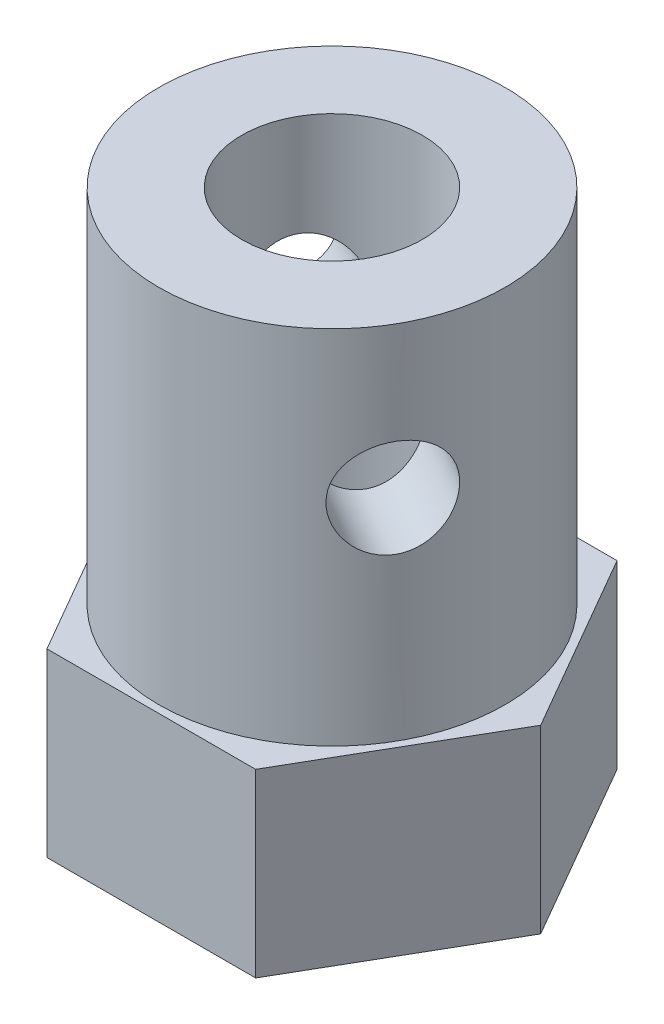
ISO-10303-21;
HEADER;
FILE_DESCRIPTION(('STEP AP214'),'2;1');
FILE_NAME('part.step','',(''),(''),'','','');
FILE_SCHEMA(('AUTOMOTIVE_DESIGN { 1 0 10303 214 1 1 1 1 }'));
ENDSEC;
DATA;
#1=APPLICATION_CONTEXT('core data for automotive mechanical design processes');
#2=APPLICATION_PROTOCOL_DEFINITION('international standard','automotive_design',2000,#1);
#3=PRODUCT_CONTEXT('',#1,'mechanical');
#4=PRODUCT('Part','Part','',(#3));
#5=PRODUCT_RELATED_PRODUCT_CATEGORY('part','',(#4));
#6=PRODUCT_DEFINITION_FORMATION('','',#4);
#7=PRODUCT_DEFINITION_CONTEXT('part definition',#1,'design');
#8=PRODUCT_DEFINITION('design','',#6,#7);
#9=PRODUCT_DEFINITION_SHAPE('','',#8);
#10=(LENGTH_UNIT() NAMED_UNIT(*) SI_UNIT(.MILLI.,.METRE.));
#11=(NAMED_UNIT(*) PLANE_ANGLE_UNIT() SI_UNIT($,.RADIAN.));
#12=(NAMED_UNIT(*) SI_UNIT($,.STERADIAN.) SOLID_ANGLE_UNIT());
#13=UNCERTAINTY_MEASURE_WITH_UNIT(LENGTH_MEASURE(1.E-05),#10,'distance_accuracy_value','');
#14=(GEOMETRIC_REPRESENTATION_CONTEXT(3) GLOBAL_UNCERTAINTY_ASSIGNED_CONTEXT((#13)) GLOBAL_UNIT_ASSIGNED_CONTEXT((#10,
#11,#12)) REPRESENTATION_CONTEXT('',''));
#15=CARTESIAN_POINT('',(0.,0.,0.));
#16=DIRECTION('',(0.,0.,1.));
#17=DIRECTION('',(1.,0.,0.));
#18=AXIS2_PLACEMENT_3D('',#15,#16,#17);
#19=CARTESIAN_POINT('',(0.,300.,0.));
#20=DIRECTION('',(0.,-1.,0.));
#21=DIRECTION('',(0.,0.,-1.));
#22=AXIS2_PLACEMENT_3D('',#19,#20,#21);
#23=CYLINDRICAL_SURFACE('',#22,1.625);
#24=CARTESIAN_POINT('',(0.,0.,0.));
#25=DIRECTION('',(0.,-1.,0.));
#26=DIRECTION('',(0.,0.,-1.));
#27=AXIS2_PLACEMENT_3D('',#24,#25,#26);
#28=CIRCLE('',#27,1.625);
#29=CARTESIAN_POINT('',(0.,0.,-1.625));
#30=VERTEX_POINT('',#29);
#31=EDGE_CURVE('E154',#30,#30,#28,.T.);
#32=ORIENTED_EDGE('',*,*,#31,.T.);
#33=EDGE_LOOP('',(#32));
#34=FACE_BOUND('',#33,.T.);
#35=CARTESIAN_POINT('',(0.,6.00000000000001,0.));
#36=DIRECTION('',(0.,1.,0.));
#37=DIRECTION('',(0.,0.,1.));
#38=AXIS2_PLACEMENT_3D('',#35,#36,#37);
#39=CIRCLE('',#38,1.625);
#40=CARTESIAN_POINT('',(0.,6.00000000000001,1.625));
#41=VERTEX_POINT('',#40);
#42=EDGE_CURVE('E152',#41,#41,#39,.F.);
#43=ORIENTED_EDGE('',*,*,#42,.F.);
#44=EDGE_LOOP('',(#43));
#45=FACE_BOUND('',#44,.T.);
#46=ADVANCED_FACE('F40',(#34,#45),#23,.F.);
#47=CARTESIAN_POINT('',(3.46410161513775,6.,6.00000000000003));
#48=DIRECTION('',(-0.866025403784439,0.,-0.499999999999999));
#49=DIRECTION('',(-0.499999999999999,0.,0.866025403784439));
#50=AXIS2_PLACEMENT_3D('',#47,#48,#49);
#51=PLANE('',#50);
#52=DIRECTION('',(0.499999999999999,0.,-0.866025403784439));
#53=VECTOR('',#52,1.);
#54=CARTESIAN_POINT('',(3.46410161513775,0.,6.00000000000003));
#55=LINE('',#54,#53);
#56=CARTESIAN_POINT('',(3.46410161513775,0.,6.00000000000003));
#57=VERTEX_POINT('',#56);
#58=CARTESIAN_POINT('',(6.92820323027551,0.,0.));
#59=VERTEX_POINT('',#58);
#60=EDGE_CURVE('E133',#57,#59,#55,.T.);
#61=ORIENTED_EDGE('',*,*,#60,.T.);
#62=DIRECTION('',(0.,-1.,0.));
#63=VECTOR('',#62,1.);
#64=CARTESIAN_POINT('',(6.92820323027551,6.,0.));
#65=LINE('',#64,#63);
#66=CARTESIAN_POINT('',(6.92820323027551,6.,0.));
#67=VERTEX_POINT('',#66);
#68=EDGE_CURVE('E55',#67,#59,#65,.T.);
#69=ORIENTED_EDGE('',*,*,#68,.F.);
#70=DIRECTION('',(0.499999999999999,0.,-0.866025403784439));
#71=VECTOR('',#70,1.);
#72=CARTESIAN_POINT('',(3.46410161513775,6.,6.00000000000003));
#73=LINE('',#72,#71);
#74=CARTESIAN_POINT('',(3.46410161513775,6.,6.00000000000003));
#75=VERTEX_POINT('',#74);
#76=EDGE_CURVE('E144',#75,#67,#73,.T.);
#77=ORIENTED_EDGE('',*,*,#76,.F.);
#78=DIRECTION('',(0.,-1.,0.));
#79=VECTOR('',#78,1.);
#80=CARTESIAN_POINT('',(3.46410161513775,6.,6.00000000000003));
#81=LINE('',#80,#79);
#82=EDGE_CURVE('E129',#75,#57,#81,.T.);
#83=ORIENTED_EDGE('',*,*,#82,.T.);
#84=EDGE_LOOP('',(#61,#69,#77,#83));
#85=FACE_BOUND('',#84,.T.);
#86=ADVANCED_FACE('F42',(#85),#51,.F.);
#87=CARTESIAN_POINT('',(6.92820323027551,6.,0.));
#88=DIRECTION('',(-0.866025403784438,0.,0.5));
#89=DIRECTION('',(0.5,0.,0.866025403784439));
#90=AXIS2_PLACEMENT_3D('',#87,#88,#89);
#91=PLANE('',#90);
#92=DIRECTION('',(-0.5,0.,-0.866025403784439));
#93=VECTOR('',#92,1.);
#94=CARTESIAN_POINT('',(6.92820323027551,0.,0.));
#95=LINE('',#94,#93);
#96=CARTESIAN_POINT('',(3.46410161513772,0.,-6.00000000000004));
#97=VERTEX_POINT('',#96);
#98=EDGE_CURVE('E136',#59,#97,#95,.T.);
#99=ORIENTED_EDGE('',*,*,#98,.T.);
#100=DIRECTION('',(0.,-1.,0.));
#101=VECTOR('',#100,1.);
#102=CARTESIAN_POINT('',(3.46410161513772,6.,-6.00000000000004));
#103=LINE('',#102,#101);
#104=CARTESIAN_POINT('',(3.46410161513772,6.,-6.00000000000004));
#105=VERTEX_POINT('',#104);
#106=EDGE_CURVE('E148',#105,#97,#103,.T.);
#107=ORIENTED_EDGE('',*,*,#106,.F.);
#108=DIRECTION('',(-0.5,0.,-0.866025403784439));
#109=VECTOR('',#108,1.);
#110=CARTESIAN_POINT('',(6.92820323027551,6.,0.));
#111=LINE('',#110,#109);
#112=EDGE_CURVE('E102',#67,#105,#111,.T.);
#113=ORIENTED_EDGE('',*,*,#112,.F.);
#114=ORIENTED_EDGE('',*,*,#68,.T.);
#115=EDGE_LOOP('',(#99,#107,#113,#114));
#116=FACE_BOUND('',#115,.T.);
#117=ADVANCED_FACE('F211',(#116),#91,.F.);
#118=CARTESIAN_POINT('',(3.46410161513772,6.,-6.00000000000004));
#119=DIRECTION('',(0.,0.,1.));
#120=DIRECTION('',(1.,0.,0.));
#121=AXIS2_PLACEMENT_3D('',#118,#119,#120);
#122=PLANE('',#121);
#123=DIRECTION('',(-1.,0.,0.));
#124=VECTOR('',#123,1.);
#125=CARTESIAN_POINT('',(3.46410161513772,0.,-6.00000000000004));
#126=LINE('',#125,#124);
#127=CARTESIAN_POINT('',(-3.46410161513776,0.,-6.00000000000004));
#128=VERTEX_POINT('',#127);
#129=EDGE_CURVE('E139',#97,#128,#126,.T.);
#130=ORIENTED_EDGE('',*,*,#129,.T.);
#131=DIRECTION('',(0.,-1.,0.));
#132=VECTOR('',#131,1.);
#133=CARTESIAN_POINT('',(-3.46410161513776,6.,-6.00000000000004));
#134=LINE('',#133,#132);
#135=CARTESIAN_POINT('',(-3.46410161513776,6.,-6.00000000000004));
#136=VERTEX_POINT('',#135);
#137=EDGE_CURVE('E124',#136,#128,#134,.T.);
#138=ORIENTED_EDGE('',*,*,#137,.F.);
#139=DIRECTION('',(-1.,0.,0.));
#140=VECTOR('',#139,1.);
#141=CARTESIAN_POINT('',(3.46410161513772,6.,-6.00000000000004));
#142=LINE('',#141,#140);
#143=EDGE_CURVE('E115',#105,#136,#142,.T.);
#144=ORIENTED_EDGE('',*,*,#143,.F.);
#145=ORIENTED_EDGE('',*,*,#106,.T.);
#146=EDGE_LOOP('',(#130,#138,#144,#145));
#147=FACE_BOUND('',#146,.T.);
#148=ADVANCED_FACE('F209',(#147),#122,.F.);
#149=CARTESIAN_POINT('',(-3.46410161513776,6.,-6.00000000000004));
#150=DIRECTION('',(0.866025403784439,0.,0.5));
#151=DIRECTION('',(0.5,0.,-0.866025403784439));
#152=AXIS2_PLACEMENT_3D('',#149,#150,#151);
#153=PLANE('',#152);
#154=DIRECTION('',(-0.5,0.,0.866025403784439));
#155=VECTOR('',#154,1.);
#156=CARTESIAN_POINT('',(-3.46410161513776,0.,-6.00000000000004));
#157=LINE('',#156,#155);
#158=CARTESIAN_POINT('',(-6.92820323027554,0.,0.));
#159=VERTEX_POINT('',#158);
#160=EDGE_CURVE('E123',#128,#159,#157,.T.);
#161=ORIENTED_EDGE('',*,*,#160,.T.);
#162=DIRECTION('',(0.,-1.,0.));
#163=VECTOR('',#162,1.);
#164=CARTESIAN_POINT('',(-6.92820323027554,6.,0.));
#165=LINE('',#164,#163);
#166=CARTESIAN_POINT('',(-6.92820323027554,6.,0.));
#167=VERTEX_POINT('',#166);
#168=EDGE_CURVE('E120',#167,#159,#165,.T.);
#169=ORIENTED_EDGE('',*,*,#168,.F.);
#170=DIRECTION('',(-0.5,0.,0.866025403784439));
#171=VECTOR('',#170,1.);
#172=CARTESIAN_POINT('',(-3.46410161513776,6.,-6.00000000000004));
#173=LINE('',#172,#171);
#174=EDGE_CURVE('E109',#136,#167,#173,.T.);
#175=ORIENTED_EDGE('',*,*,#174,.F.);
#176=ORIENTED_EDGE('',*,*,#137,.T.);
#177=EDGE_LOOP('',(#161,#169,#175,#176));
#178=FACE_BOUND('',#177,.T.);
#179=ADVANCED_FACE('F121',(#178),#153,.F.);
#180=CARTESIAN_POINT('',(-6.92820323027554,6.,0.));
#181=DIRECTION('',(0.866025403784439,0.,-0.499999999999999));
#182=DIRECTION('',(-0.499999999999999,0.,-0.866025403784439));
#183=AXIS2_PLACEMENT_3D('',#180,#181,#182);
#184=PLANE('',#183);
#185=DIRECTION('',(0.499999999999999,0.,0.866025403784439));
#186=VECTOR('',#185,1.);
#187=CARTESIAN_POINT('',(-6.92820323027554,0.,0.));
#188=LINE('',#187,#186);
#189=CARTESIAN_POINT('',(-3.46410161513777,0.,6.00000000000003));
#190=VERTEX_POINT('',#189);
#191=EDGE_CURVE('E87',#159,#190,#188,.T.);
#192=ORIENTED_EDGE('',*,*,#191,.T.);
#193=DIRECTION('',(0.,-1.,0.));
#194=VECTOR('',#193,1.);
#195=CARTESIAN_POINT('',(-3.46410161513777,6.,6.00000000000003));
#196=LINE('',#195,#194);
#197=CARTESIAN_POINT('',(-3.46410161513777,6.,6.00000000000003));
#198=VERTEX_POINT('',#197);
#199=EDGE_CURVE('E125',#198,#190,#196,.T.);
#200=ORIENTED_EDGE('',*,*,#199,.F.);
#201=DIRECTION('',(0.499999999999999,0.,0.866025403784439));
#202=VECTOR('',#201,1.);
#203=CARTESIAN_POINT('',(-6.92820323027554,6.,0.));
#204=LINE('',#203,#202);
#205=EDGE_CURVE('E113',#167,#198,#204,.T.);
#206=ORIENTED_EDGE('',*,*,#205,.F.);
#207=ORIENTED_EDGE('',*,*,#168,.T.);
#208=EDGE_LOOP('',(#192,#200,#206,#207));
#209=FACE_BOUND('',#208,.T.);
#210=ADVANCED_FACE('F127',(#209),#184,.F.);
#211=CARTESIAN_POINT('',(-3.46410161513777,6.,6.00000000000003));
#212=DIRECTION('',(0.,0.,-1.));
#213=DIRECTION('',(-1.,0.,0.));
#214=AXIS2_PLACEMENT_3D('',#211,#212,#213);
#215=PLANE('',#214);
#216=DIRECTION('',(1.,0.,0.));
#217=VECTOR('',#216,1.);
#218=CARTESIAN_POINT('',(-3.46410161513777,0.,6.00000000000003));
#219=LINE('',#218,#217);
#220=EDGE_CURVE('E93',#190,#57,#219,.T.);
#221=ORIENTED_EDGE('',*,*,#220,.T.);
#222=ORIENTED_EDGE('',*,*,#82,.F.);
#223=DIRECTION('',(1.,0.,0.));
#224=VECTOR('',#223,1.);
#225=CARTESIAN_POINT('',(-3.46410161513777,6.,6.00000000000003));
#226=LINE('',#225,#224);
#227=EDGE_CURVE('E64',#198,#75,#226,.T.);
#228=ORIENTED_EDGE('',*,*,#227,.F.);
#229=ORIENTED_EDGE('',*,*,#199,.T.);
#230=EDGE_LOOP('',(#221,#222,#228,#229));
#231=FACE_BOUND('',#230,.T.);
#232=ADVANCED_FACE('F198',(#231),#215,.F.);
#233=CARTESIAN_POINT('',(0.,6.,0.));
#234=DIRECTION('',(0.,1.,0.));
#235=DIRECTION('',(0.,0.,1.));
#236=AXIS2_PLACEMENT_3D('',#233,#234,#235);
#237=PLANE('',#236);
#238=CARTESIAN_POINT('',(0.,6.,0.));
#239=DIRECTION('',(0.,1.,0.));
#240=DIRECTION('',(0.,0.,1.));
#241=AXIS2_PLACEMENT_3D('',#238,#239,#240);
#242=CIRCLE('',#241,5.75);
#243=CARTESIAN_POINT('',(0.,6.,5.75));
#244=VERTEX_POINT('',#243);
#245=EDGE_CURVE('E11',#244,#244,#242,.T.);
#246=ORIENTED_EDGE('',*,*,#245,.F.);
#247=EDGE_LOOP('',(#246));
#248=FACE_BOUND('',#247,.T.);
#249=ORIENTED_EDGE('',*,*,#76,.T.);
#250=ORIENTED_EDGE('',*,*,#112,.T.);
#251=ORIENTED_EDGE('',*,*,#143,.T.);
#252=ORIENTED_EDGE('',*,*,#174,.T.);
#253=ORIENTED_EDGE('',*,*,#205,.T.);
#254=ORIENTED_EDGE('',*,*,#227,.T.);
#255=EDGE_LOOP('',(#249,#250,#251,#252,#253,#254));
#256=FACE_BOUND('',#255,.T.);
#257=ADVANCED_FACE('F111',(#248,#256),#237,.T.);
#258=CARTESIAN_POINT('',(0.,0.,0.));
#259=DIRECTION('',(0.,1.,0.));
#260=DIRECTION('',(0.,0.,1.));
#261=AXIS2_PLACEMENT_3D('',#258,#259,#260);
#262=PLANE('',#261);
#263=ORIENTED_EDGE('',*,*,#31,.F.);
#264=EDGE_LOOP('',(#263));
#265=FACE_BOUND('',#264,.T.);
#266=ORIENTED_EDGE('',*,*,#60,.F.);
#267=ORIENTED_EDGE('',*,*,#220,.F.);
#268=ORIENTED_EDGE('',*,*,#191,.F.);
#269=ORIENTED_EDGE('',*,*,#160,.F.);
#270=ORIENTED_EDGE('',*,*,#129,.F.);
#271=ORIENTED_EDGE('',*,*,#98,.F.);
#272=EDGE_LOOP('',(#266,#267,#268,#269,#270,#271));
#273=FACE_BOUND('',#272,.T.);
#274=ADVANCED_FACE('F193',(#265,#273),#262,.F.);
#275=CARTESIAN_POINT('',(0.,18.,0.));
#276=DIRECTION('',(0.,-1.,0.));
#277=DIRECTION('',(0.,0.,-1.));
#278=AXIS2_PLACEMENT_3D('',#275,#276,#277);
#279=CYLINDRICAL_SURFACE('',#278,5.75);
#280=CARTESIAN_POINT('',(3.96415220107137,13.,4.16509271526349));
#281=CARTESIAN_POINT('',(3.9641541874464,13.0892986537931,4.16509189151223));
#282=CARTESIAN_POINT('',(3.96974380151388,13.1786146746451,4.15979251194162));
#283=CARTESIAN_POINT('',(3.99174089863937,13.3546524793296,4.13868694896249));
#284=CARTESIAN_POINT('',(4.00815295125587,13.4413731511518,4.1228763273689));
#285=CARTESIAN_POINT('',(4.05073324895282,13.6096475467947,4.08104671201639));
#286=CARTESIAN_POINT('',(4.0768866192475,13.6912089277444,4.0550432793092));
#287=CARTESIAN_POINT('',(4.13746356273576,13.8472184761771,3.9932143636478));
#288=CARTESIAN_POINT('',(4.17188806218977,13.9216658456759,3.95738778056319));
#289=CARTESIAN_POINT('',(4.24821071383057,14.0634247835023,3.87536002449409));
#290=CARTESIAN_POINT('',(4.29027653385928,14.1305069835706,3.82891838150974));
#291=CARTESIAN_POINT('',(4.37922419735053,14.2535966597823,3.72685802272877));
#292=CARTESIAN_POINT('',(4.42610659260701,14.3096028648888,3.67123825502921));
#293=CARTESIAN_POINT('',(4.52347103327664,14.4099255118504,3.55060790184942));
#294=CARTESIAN_POINT('',(4.57400298565403,14.4540112087335,3.4854451277152));
#295=CARTESIAN_POINT('',(4.67567094365354,14.5277319000767,3.34782145628143));
#296=CARTESIAN_POINT('',(4.72680683242781,14.5573696444503,3.2753619509565));
#297=CARTESIAN_POINT('',(4.8262917699979,14.6006030318712,3.12684958600503));
#298=CARTESIAN_POINT('',(4.87467864422745,14.6145894811094,3.05093597802387));
#299=CARTESIAN_POINT('',(4.96830755885775,14.6273556742297,2.89596427405796));
#300=CARTESIAN_POINT('',(5.01355018627447,14.6261382643106,2.81690676938037));
#301=CARTESIAN_POINT('',(5.09833054620241,14.608800531078,2.66030731676779));
#302=CARTESIAN_POINT('',(5.13799348063577,14.5931028769638,2.58278578342811));
#303=CARTESIAN_POINT('',(5.21228762234986,14.5479366096088,2.42936755526787));
#304=CARTESIAN_POINT('',(5.2469185262476,14.518467166513,2.35347095865037));
#305=CARTESIAN_POINT('',(5.31111883050826,14.4462876904933,2.20480152823911));
#306=CARTESIAN_POINT('',(5.34062967435095,14.40343841565,2.13207116311612));
#307=CARTESIAN_POINT('',(5.39413228332015,14.3058239141125,1.99283922581971));
#308=CARTESIAN_POINT('',(5.4181228585509,14.251056123319,1.92633899838249));
#309=CARTESIAN_POINT('',(5.46158492741354,14.1289389860287,1.79951177907482));
#310=CARTESIAN_POINT('',(5.48087281432026,14.0612219858236,1.73947542358502));
#311=CARTESIAN_POINT('',(5.51429159197003,13.9162779036111,1.63044440946878));
#312=CARTESIAN_POINT('',(5.52842208288016,13.8390500848874,1.58145060704127));
#313=CARTESIAN_POINT('',(5.55212635194917,13.6764583346361,1.49612094155201));
#314=CARTESIAN_POINT('',(5.56166438220717,13.5910365909472,1.45988495340313));
#315=CARTESIAN_POINT('',(5.57647371118487,13.4149775902752,1.40226106580852));
#316=CARTESIAN_POINT('',(5.58174622021648,13.3243418205594,1.38086895476141));
#317=CARTESIAN_POINT('',(5.58821556325748,13.1436668067176,1.35444709212435));
#318=CARTESIAN_POINT('',(5.58954244602026,13.0537084597962,1.34889549197008));
#319=CARTESIAN_POINT('',(5.58856591072596,12.8741599421211,1.3529360284462));
#320=CARTESIAN_POINT('',(5.58626293413188,12.7845697279237,1.36252632352163));
#321=CARTESIAN_POINT('',(5.57799161219997,12.6103676427608,1.39599156114065));
#322=CARTESIAN_POINT('',(5.57210601669809,12.5256893418895,1.41954370670635));
#323=CARTESIAN_POINT('',(5.55645393875538,12.3614521832952,1.4796205393845));
#324=CARTESIAN_POINT('',(5.54668690491455,12.2818940548143,1.51614706956931));
#325=CARTESIAN_POINT('',(5.52258171186874,12.1280207464014,1.60175175300989));
#326=CARTESIAN_POINT('',(5.5081382866916,12.0538798482566,1.65111322367273));
#327=CARTESIAN_POINT('',(5.47428418177793,11.914846188354,1.76010308761131));
#328=CARTESIAN_POINT('',(5.45487244902102,11.8499553916773,1.81973365651918));
#329=CARTESIAN_POINT('',(5.40992779571427,11.7290648002513,1.9493670300973));
#330=CARTESIAN_POINT('',(5.38421428068165,11.673428352788,2.01964682789069));
#331=CARTESIAN_POINT('',(5.326760033749,11.5753144458545,2.1666438020056));
#332=CARTESIAN_POINT('',(5.2950196190601,11.5328362941391,2.24336063941072));
#333=CARTESIAN_POINT('',(5.22584533402381,11.4626484343949,2.40006494895062));
#334=CARTESIAN_POINT('',(5.18845743536733,11.4348269568689,2.48002250839512));
#335=CARTESIAN_POINT('',(5.1083426945541,11.3944328494278,2.64110110766055));
#336=CARTESIAN_POINT('',(5.06561719660236,11.3818563887581,2.72222185001179));
#337=CARTESIAN_POINT('',(4.97742153999133,11.3725735154658,2.88022249146787));
#338=CARTESIAN_POINT('',(4.93209596609821,11.3753370889542,2.95715237244409));
#339=CARTESIAN_POINT('',(4.83882073344542,11.3954082961624,3.10743226715097));
#340=CARTESIAN_POINT('',(4.79087119573589,11.4127152594865,3.18078244572759));
#341=CARTESIAN_POINT('',(4.69445321460202,11.4610682562626,3.32141881519403));
#342=CARTESIAN_POINT('',(4.64599275158886,11.4919951519108,3.3887516293328));
#343=CARTESIAN_POINT('',(4.54996147559146,11.5666041607801,3.51663944252574));
#344=CARTESIAN_POINT('',(4.50239079952844,11.61028822018,3.57719340547583));
#345=CARTESIAN_POINT('',(4.40867047157929,11.7106571233163,3.69212512516719));
#346=CARTESIAN_POINT('',(4.36260303967221,11.7676847545569,3.74627052343844));
#347=CARTESIAN_POINT('',(4.27544448813188,11.8924872880081,3.84544436270562));
#348=CARTESIAN_POINT('',(4.23435473703781,11.9602651340555,3.89047029871716));
#349=CARTESIAN_POINT('',(4.15818381172913,12.1067243468501,3.97180030511729));
#350=CARTESIAN_POINT('',(4.12328286745032,12.1856399495748,4.00785229200068));
#351=CARTESIAN_POINT('',(4.06280655978831,12.3508687178449,4.06914838316514));
#352=CARTESIAN_POINT('',(4.03722582670805,12.4371775883552,4.09439871212094));
#353=CARTESIAN_POINT('',(3.99975600518809,12.6024810937603,4.1309850900009));
#354=CARTESIAN_POINT('',(3.98646597604032,12.680844773293,4.14375903186122));
#355=CARTESIAN_POINT('',(3.9686638383837,12.8394678143913,4.16081257876398));
#356=CARTESIAN_POINT('',(3.96415041546214,12.9197268902739,4.16509345575702));
#357=CARTESIAN_POINT('',(3.96415220107137,13.,4.16509271526349));
#358=B_SPLINE_CURVE_WITH_KNOTS('',3,(#280,#281,#282,#283,#284,#285,#286,#287,#288,#289,#290,
#291,#292,#293,#294,#295,#296,#297,#298,#299,#300,#301,#302,#303,#304,#305,#306,#307,#308,#309,
#310,#311,#312,#313,#314,#315,#316,#317,#318,#319,#320,#321,#322,#323,#324,#325,#326,#327,#328,
#329,#330,#331,#332,#333,#334,#335,#336,#337,#338,#339,#340,#341,#342,#343,#344,#345,#346,#347,
#348,#349,#350,#351,#352,#353,#354,#355,#356,#357),.UNSPECIFIED.,.T.,.F.,(4,2,2,2,2,2,2,2,2,2,2,
2,2,2,2,2,2,2,2,2,2,2,2,2,2,2,2,2,2,2,2,2,2,2,2,2,2,2,4),(0.,0.267600361875048,
0.535313785066747,0.802620080333404,1.06995632444202,1.34408507472553,1.61824526469603,
1.89738398060021,2.17646954659856,2.44841913376606,2.720317812081,2.98452281586096,
3.24874374205551,3.51581156456791,3.78293689982543,4.05924098980623,4.33556649602476,
4.61400948728768,4.89237344455493,5.16145477153547,5.43050337540751,5.69356170167318,
5.95665741156591,6.22614345468035,6.49568666205604,6.77411002172573,7.0525187313225,
7.32877242912246,7.60495669573642,7.87165924151668,8.13834949398295,8.4027518764793,
8.66719461617271,8.93936949607837,9.21161903739504,9.49082077026431,9.76986139000984,
10.0104510306059,10.2510046369494),.UNSPECIFIED.);
#359=CARTESIAN_POINT('',(3.96415220107137,13.,4.16509271526349));
#360=VERTEX_POINT('',#359);
#361=EDGE_CURVE('E182',#360,#360,#358,.T.);
#362=ORIENTED_EDGE('',*,*,#361,.T.);
#363=EDGE_LOOP('',(#362));
#364=FACE_BOUND('',#363,.T.);
#365=CARTESIAN_POINT('',(-5.58915220107137,13.,-1.35051015296406));
#366=CARTESIAN_POINT('',(-5.58915248086937,12.9107013462069,-1.35051228509093));
#367=CARTESIAN_POINT('',(-5.58735789057066,12.8213853253549,-1.35800272265602));
#368=CARTESIAN_POINT('',(-5.58007848543231,12.6453475206704,-1.38760554906577));
#369=CARTESIAN_POINT('',(-5.57459211179089,12.5586268488482,-1.4097241143567));
#370=CARTESIAN_POINT('',(-5.55965675111356,12.3903524532053,-1.46751454153922));
#371=CARTESIAN_POINT('',(-5.55021380295088,12.3087910722556,-1.50316574096259));
#372=CARTESIAN_POINT('',(-5.52695686304378,12.1527815238229,-1.58654137073775));
#373=CARTESIAN_POINT('',(-5.51314238168872,12.0783341543241,-1.63426715331978));
#374=CARTESIAN_POINT('',(-5.48026558693785,11.9365752164977,-1.74137838655946));
#375=CARTESIAN_POINT('',(-5.46107885433427,11.8694930164294,-1.80102927682752));
#376=CARTESIAN_POINT('',(-5.41716582265622,11.7464033402177,-1.92909039240869));
#377=CARTESIAN_POINT('',(-5.39243888850405,11.6903971351112,-1.99750162154085));
#378=CARTESIAN_POINT('',(-5.33665215851768,11.5900744881496,-2.1421368771759));
#379=CARTESIAN_POINT('',(-5.30548551692507,11.5459887912665,-2.21848021870466));
#380=CARTESIAN_POINT('',(-5.2371339003011,11.4722680999233,-2.37533908880002));
#381=CARTESIAN_POINT('',(-5.19995007233119,11.4426303555497,-2.45585382018608));
#382=CARTESIAN_POINT('',(-5.12107706029216,11.3993969681288,-2.61626648589144));
#383=CARTESIAN_POINT('',(-5.07952738440232,11.3854105188906,-2.69612755217452));
#384=CARTESIAN_POINT('',(-4.99213240921522,11.3726443257703,-2.85469842275608));
#385=CARTESIAN_POINT('',(-4.94628791551299,11.3738617356894,-2.93340843977171));
#386=CARTESIAN_POINT('',(-4.85305899129572,11.391199468922,-3.08513011151759));
#387=CARTESIAN_POINT('',(-4.80575484129992,11.4068971230362,-3.15823998699536));
#388=CARTESIAN_POINT('',(-4.7100378291666,11.4520633903912,-3.29928971515224));
#389=CARTESIAN_POINT('',(-4.66162490038393,11.481532833487,-3.36722925599245));
#390=CARTESIAN_POINT('',(-4.56497354901195,11.5537123095067,-3.4971630656185));
#391=CARTESIAN_POINT('',(-4.51674262711027,11.59656158435,-3.55908538863488));
#392=CARTESIAN_POINT('',(-4.42291553687805,11.6941760858875,-3.67503597581916));
#393=CARTESIAN_POINT('',(-4.37731993817535,11.748943876681,-3.729062537139));
#394=CARTESIAN_POINT('',(-4.28921537879489,11.8710610139713,-3.8301154025289));
#395=CARTESIAN_POINT('',(-4.24686631324345,11.9387780141764,-3.87683738032035));
#396=CARTESIAN_POINT('',(-4.1691520740433,12.0837220963889,-3.96029439778659));
#397=CARTESIAN_POINT('',(-4.13378744196814,12.1609499151126,-3.99702866309646));
#398=CARTESIAN_POINT('',(-4.07174191849252,12.3235416653639,-4.060221995033));
#399=CARTESIAN_POINT('',(-4.04512964735335,12.4089634090528,-4.08660016561294));
#400=CARTESIAN_POINT('',(-4.00263056132045,12.5850224097248,-4.12823736451792));
#401=CARTESIAN_POINT('',(-3.98674070422889,12.6756581794407,-4.14349954680454));
#402=CARTESIAN_POINT('',(-3.96709337149039,12.8563331932824,-4.16231309354237));
#403=CARTESIAN_POINT('',(-3.96294898610653,12.9462915402038,-4.16623800779991));
#404=CARTESIAN_POINT('',(-3.96595992569261,13.1258400578789,-4.1633720351893));
#405=CARTESIAN_POINT('',(-3.97311387656068,13.2154302720763,-4.15658245141679));
#406=CARTESIAN_POINT('',(-3.99795996151649,13.3896323572392,-4.13268665769137));
#407=CARTESIAN_POINT('',(-4.01541392013907,13.4743106581105,-4.11581350968749));
#408=CARTESIAN_POINT('',(-4.0596159444459,13.6385478167048,-4.07221999622802));
#409=CARTESIAN_POINT('',(-4.08636533057762,13.7181059451857,-4.04549823170983));
#410=CARTESIAN_POINT('',(-4.14844856459719,13.8719792535986,-3.98182018044874));
#411=CARTESIAN_POINT('',(-4.1839751395708,13.9461201517434,-3.94463107199625));
#412=CARTESIAN_POINT('',(-4.26143607803978,14.085153811646,-3.86081762514935));
#413=CARTESIAN_POINT('',(-4.30337179917767,14.1500446083227,-3.81419128699645));
#414=CARTESIAN_POINT('',(-4.39316526722122,14.2709351997487,-3.71045138867946));
#415=CARTESIAN_POINT('',(-4.44117259996682,14.326571647212,-3.65304293254393));
#416=CARTESIAN_POINT('',(-4.53974859036345,14.4246855541455,-3.52978760808749));
#417=CARTESIAN_POINT('',(-4.59031711310983,14.4671637058609,-3.46394118393769));
#418=CARTESIAN_POINT('',(-4.69143988353574,14.5373515656051,-3.32568234103769));
#419=CARTESIAN_POINT('',(-4.74199121191105,14.5651730431311,-3.25332469128481));
#420=CARTESIAN_POINT('',(-4.8414320004743,14.6055671505722,-3.10340399089023));
#421=CARTESIAN_POINT('',(-4.89032187514846,14.6181436112419,-3.02584225309906));
#422=CARTESIAN_POINT('',(-4.98305661615814,14.6274264845342,-2.87046225324242));
#423=CARTESIAN_POINT('',(-5.02701706044711,14.6246629110458,-2.79274421432176));
#424=CARTESIAN_POINT('',(-5.11052565061492,14.6045917038376,-2.63682554594711));
#425=CARTESIAN_POINT('',(-5.15007399977963,14.5872847405135,-2.55862493890262));
#426=CARTESIAN_POINT('',(-5.22365967786665,14.5389317437374,-2.40480633312586));
#427=CARTESIAN_POINT('',(-5.25774137391254,14.5080048480892,-2.32917193400792));
#428=CARTESIAN_POINT('',(-5.32047983097336,14.4333958392199,-2.18206250283987));
#429=CARTESIAN_POINT('',(-5.34913576315645,14.38971177982,-2.11058810741905));
#430=CARTESIAN_POINT('',(-5.40180938813523,14.2893428766837,-1.97195806271839));
#431=CARTESIAN_POINT('',(-5.42566696258262,14.2323152454431,-1.90498979726413));
#432=CARTESIAN_POINT('',(-5.46797475100867,14.1075127119919,-1.77992135783955));
#433=CARTESIAN_POINT('',(-5.4864234798768,14.0397348659445,-1.72182362155114));
#434=CARTESIAN_POINT('',(-5.51877186885492,13.8932756531499,-1.61519266200399));
#435=CARTESIAN_POINT('',(-5.53254333321343,13.8143600504252,-1.56694156420079));
#436=CARTESIAN_POINT('',(-5.55538915148354,13.6491312821551,-1.48391949985617));
#437=CARTESIAN_POINT('',(-5.56446621127305,13.5628224116448,-1.44914077068334));
#438=CARTESIAN_POINT('',(-5.57741603318957,13.3975189062397,-1.3983977644318));
#439=CARTESIAN_POINT('',(-5.58183357677318,13.319155226707,-1.38050129064264));
#440=CARTESIAN_POINT('',(-5.58770131278729,13.1605321856087,-1.35655741373896));
#441=CARTESIAN_POINT('',(-5.58915194955296,13.0802731097261,-1.35050823633434));
#442=CARTESIAN_POINT('',(-5.58915220107137,13.,-1.35051015296406));
#443=B_SPLINE_CURVE_WITH_KNOTS('',3,(#365,#366,#367,#368,#369,#370,#371,#372,#373,#374,#375,
#376,#377,#378,#379,#380,#381,#382,#383,#384,#385,#386,#387,#388,#389,#390,#391,#392,#393,#394,
#395,#396,#397,#398,#399,#400,#401,#402,#403,#404,#405,#406,#407,#408,#409,#410,#411,#412,#413,
#414,#415,#416,#417,#418,#419,#420,#421,#422,#423,#424,#425,#426,#427,#428,#429,#430,#431,#432,
#433,#434,#435,#436,#437,#438,#439,#440,#441,#442),.UNSPECIFIED.,.T.,.F.,(4,2,2,2,2,2,2,2,2,2,2,
2,2,2,2,2,2,2,2,2,2,2,2,2,2,2,2,2,2,2,2,2,2,2,2,2,2,2,4),(0.,0.267600361875048,
0.535313785066747,0.802620080333406,1.06995632444202,1.34408507472553,1.61824526469603,
1.89738398060021,2.17646954659856,2.44841913376607,2.720317812081,2.98452281586096,
3.24874374205551,3.51581156456792,3.78293689982543,4.05924098980623,4.33556649602476,
4.61400948728768,4.89237344455494,5.16145477153547,5.43050337540751,5.69356170167318,
5.95665741156591,6.22614345468036,6.49568666205604,6.77411002172573,7.0525187313225,
7.32877242912246,7.60495669573642,7.87165924151668,8.13834949398295,8.40275187647929,
8.6671946161727,8.93936949607837,9.21161903739504,9.49082077026431,9.76986139000984,
10.0104510306059,10.2510046369494),.UNSPECIFIED.);
#444=CARTESIAN_POINT('',(-5.58915220107137,13.,-1.35051015296406));
#445=VERTEX_POINT('',#444);
#446=EDGE_CURVE('E176',#445,#445,#443,.T.);
#447=ORIENTED_EDGE('',*,*,#446,.T.);
#448=EDGE_LOOP('',(#447));
#449=FACE_BOUND('',#448,.T.);
#450=CARTESIAN_POINT('',(0.,18.,0.));
#451=DIRECTION('',(0.,1.,0.));
#452=DIRECTION('',(0.,0.,1.));
#453=AXIS2_PLACEMENT_3D('',#450,#451,#452);
#454=CIRCLE('',#453,5.75);
#455=CARTESIAN_POINT('',(0.,18.,5.75));
#456=VERTEX_POINT('',#455);
#457=EDGE_CURVE('E137',#456,#456,#454,.T.);
#458=ORIENTED_EDGE('',*,*,#457,.F.);
#459=EDGE_LOOP('',(#458));
#460=FACE_BOUND('',#459,.T.);
#461=ORIENTED_EDGE('',*,*,#245,.T.);
#462=EDGE_LOOP('',(#461));
#463=FACE_BOUND('',#462,.T.);
#464=ADVANCED_FACE('F187',(#364,#449,#460,#463),#279,.T.);
#465=CARTESIAN_POINT('',(0.,18.,0.));
#466=DIRECTION('',(0.,1.,0.));
#467=DIRECTION('',(0.,0.,1.));
#468=AXIS2_PLACEMENT_3D('',#465,#466,#467);
#469=PLANE('',#468);
#470=CARTESIAN_POINT('',(0.,18.,0.));
#471=DIRECTION('',(0.,1.,0.));
#472=DIRECTION('',(0.,0.,1.));
#473=AXIS2_PLACEMENT_3D('',#470,#471,#472);
#474=CIRCLE('',#473,3.);
#475=CARTESIAN_POINT('',(0.,18.,3.));
#476=VERTEX_POINT('',#475);
#477=EDGE_CURVE('E238',#476,#476,#474,.T.);
#478=ORIENTED_EDGE('',*,*,#477,.F.);
#479=EDGE_LOOP('',(#478));
#480=FACE_BOUND('',#479,.T.);
#481=ORIENTED_EDGE('',*,*,#457,.T.);
#482=EDGE_LOOP('',(#481));
#483=FACE_BOUND('',#482,.T.);
#484=ADVANCED_FACE('F192',(#480,#483),#469,.T.);
#485=CARTESIAN_POINT('',(0.,6.,0.));
#486=DIRECTION('',(0.,1.,0.));
#487=DIRECTION('',(0.,0.,1.));
#488=AXIS2_PLACEMENT_3D('',#485,#486,#487);
#489=PLANE('',#488);
#490=CARTESIAN_POINT('',(0.,6.,0.));
#491=DIRECTION('',(0.,1.,0.));
#492=DIRECTION('',(0.,0.,1.));
#493=AXIS2_PLACEMENT_3D('',#490,#491,#492);
#494=CIRCLE('',#493,3.);
#495=CARTESIAN_POINT('',(0.,6.,3.));
#496=VERTEX_POINT('',#495);
#497=EDGE_CURVE('E155',#496,#496,#494,.T.);
#498=ORIENTED_EDGE('',*,*,#497,.T.);
#499=EDGE_LOOP('',(#498));
#500=FACE_BOUND('',#499,.T.);
#501=ORIENTED_EDGE('',*,*,#42,.T.);
#502=EDGE_LOOP('',(#501));
#503=FACE_BOUND('',#502,.T.);
#504=ADVANCED_FACE('F170',(#500,#503),#489,.T.);
#505=CARTESIAN_POINT('',(0.,6.,0.));
#506=DIRECTION('',(0.,1.,0.));
#507=DIRECTION('',(0.,0.,1.));
#508=AXIS2_PLACEMENT_3D('',#505,#506,#507);
#509=CYLINDRICAL_SURFACE('',#508,3.);
#510=CARTESIAN_POINT('',(1.37142565120702,13.,2.66818134376422));
#511=CARTESIAN_POINT('',(1.37143639103294,12.916475671071,2.66818018446441));
#512=CARTESIAN_POINT('',(1.37831792847589,12.8328724464427,2.66467335781181));
#513=CARTESIAN_POINT('',(1.40509505230754,12.6683256364093,2.6506452706175));
#514=CARTESIAN_POINT('',(1.42501343216688,12.5873869704903,2.64011172401611));
#515=CARTESIAN_POINT('',(1.47572842180995,12.430874715879,2.61209703366962));
#516=CARTESIAN_POINT('',(1.50645894591289,12.3552718113005,2.59465801786187));
#517=CARTESIAN_POINT('',(1.5764623578448,12.2102769396468,2.55272930321949));
#518=CARTESIAN_POINT('',(1.61573683548053,12.1408861318772,2.52823829191775));
#519=CARTESIAN_POINT('',(1.70470287903074,12.0028129775797,2.46923146399434));
#520=CARTESIAN_POINT('',(1.75503758541197,11.9348636479119,2.43396946764807));
#521=CARTESIAN_POINT('',(1.86052083276262,11.8086867522882,2.35432222475188));
#522=CARTESIAN_POINT('',(1.91567213760541,11.7504648246948,2.3099317200039));
#523=CARTESIAN_POINT('',(2.03285644750813,11.6406687261402,2.20771794634782));
#524=CARTESIAN_POINT('',(2.09508172233653,11.5900399776991,2.14908834072953));
#525=CARTESIAN_POINT('',(2.21880549323639,11.5036176638638,2.02108876886206));
#526=CARTESIAN_POINT('',(2.28030449371232,11.4678131327438,1.95172679389259));
#527=CARTESIAN_POINT('',(2.39441146803398,11.4151079334474,1.80953494933586));
#528=CARTESIAN_POINT('',(2.44733595493498,11.3969089651062,1.73744331094104));
#529=CARTESIAN_POINT('',(2.54731377919422,11.3756106088088,1.58723322435764));
#530=CARTESIAN_POINT('',(2.59437138102819,11.3725001903224,1.50911922129146));
#531=CARTESIAN_POINT('',(2.67640491465492,11.381071559981,1.35776026414216));
#532=CARTESIAN_POINT('',(2.71212270266907,11.3912819292077,1.28482744727243));
#533=CARTESIAN_POINT('',(2.77670483929652,11.4235076766437,1.13855288092534));
#534=CARTESIAN_POINT('',(2.8055686642212,11.445523956485,1.06521110063836));
#535=CARTESIAN_POINT('',(2.85668504525628,11.5007638134926,0.919451051320176));
#536=CARTESIAN_POINT('',(2.87885844166824,11.5341123516518,0.847052856132538));
#537=CARTESIAN_POINT('',(2.91666539130446,11.6108363315267,0.705977570742811));
#538=CARTESIAN_POINT('',(2.93229679448763,11.654215062428,0.637301710339522));
#539=CARTESIAN_POINT('',(2.95924633539139,11.7549991565026,0.49837856789991));
#540=CARTESIAN_POINT('',(2.96993367799038,11.8134026400255,0.428732877044604));
#541=CARTESIAN_POINT('',(2.9858764435761,11.9399560619413,0.298127371401608));
#542=CARTESIAN_POINT('',(2.99112647640273,12.0081155957657,0.237176227264801));
#543=CARTESIAN_POINT('',(2.99813994517873,12.1591179191137,0.121584321700716));
#544=CARTESIAN_POINT('',(2.99957577719953,12.2427114356775,0.0678949471209319));
#545=CARTESIAN_POINT('',(3.00025892822706,12.4182893101466,-0.0233587144559145));
#546=CARTESIAN_POINT('',(2.99950876595005,12.5102638930071,-0.0609415023100042));
#547=CARTESIAN_POINT('',(2.99792587926118,12.6922853402244,-0.114502744230747));
#548=CARTESIAN_POINT('',(2.99710478120773,12.7818838230033,-0.131985861259639));
#549=CARTESIAN_POINT('',(2.99631765417632,12.9627393843109,-0.148883291617251));
#550=CARTESIAN_POINT('',(2.99635072524645,13.0539946159633,-0.148316622040037));
#551=CARTESIAN_POINT('',(2.99716469213701,13.2219640289173,-0.130576703510695));
#552=CARTESIAN_POINT('',(2.99784108506737,13.2989374702016,-0.115720863820367));
#553=CARTESIAN_POINT('',(2.99916432000825,13.4494870874249,-0.0738211423486585));
#554=CARTESIAN_POINT('',(2.99981114965618,13.5230618422586,-0.0467722121822799));
#555=CARTESIAN_POINT('',(3.00012628420101,13.6684221191963,0.0193475908217241));
#556=CARTESIAN_POINT('',(2.99975098387529,13.7399920464847,0.0588885092608411));
#557=CARTESIAN_POINT('',(2.99669195232663,13.8767666654191,0.147683785502985));
#558=CARTESIAN_POINT('',(2.99400705841236,13.9419681326542,0.196943026058741));
#559=CARTESIAN_POINT('',(2.98440375841007,14.0745935425366,0.311652191798349));
#560=CARTESIAN_POINT('',(2.97690132204973,14.1408356160344,0.378425902005959));
#561=CARTESIAN_POINT('',(2.9554021805784,14.2625018443212,0.520337227742854));
#562=CARTESIAN_POINT('',(2.94140197919205,14.3179201522909,0.59547932951755));
#563=CARTESIAN_POINT('',(2.90455726455029,14.4187017647968,0.755362322902381));
#564=CARTESIAN_POINT('',(2.88133597757033,14.4634861565254,0.840385601461884));
#565=CARTESIAN_POINT('',(2.82497411800662,14.5376048697618,1.01380563865044));
#566=CARTESIAN_POINT('',(2.79184366750843,14.5669548733197,1.10219887489821));
#567=CARTESIAN_POINT('',(2.71938180978763,14.6064752454202,1.26982246556153));
#568=CARTESIAN_POINT('',(2.6810070353197,14.618275496287,1.34908169090897));
#569=CARTESIAN_POINT('',(2.59697470814951,14.6273939471731,1.50449654178324));
#570=CARTESIAN_POINT('',(2.5513207510672,14.6247192758382,1.58065367641954));
#571=CARTESIAN_POINT('',(2.45855528849765,14.6059068118321,1.7210420855342));
#572=CARTESIAN_POINT('',(2.4118992888029,14.590935370234,1.78573662485143));
#573=CARTESIAN_POINT('',(2.31558209190477,14.5497084105461,1.90897849217348));
#574=CARTESIAN_POINT('',(2.26592052607572,14.5234515059009,1.96752506372611));
#575=CARTESIAN_POINT('',(2.16361018560296,14.459502578074,2.0796054288027));
#576=CARTESIAN_POINT('',(2.11091825154128,14.4214326169207,2.13288259325953));
#577=CARTESIAN_POINT('',(2.00628218990565,14.3354043604806,2.23159452702106));
#578=CARTESIAN_POINT('',(1.95433838512872,14.287441925984,2.27702599886311));
#579=CARTESIAN_POINT('',(1.84747390592548,14.1767798254656,2.36477075993682));
#580=CARTESIAN_POINT('',(1.79287779818806,14.113028320462,2.40615512269278));
#581=CARTESIAN_POINT('',(1.68982791072343,13.975787380893,2.47961615361886));
#582=CARTESIAN_POINT('',(1.64138129367016,13.9022867910228,2.51168202301567));
#583=CARTESIAN_POINT('',(1.5511175766208,13.7421218857228,2.56847158761082));
#584=CARTESIAN_POINT('',(1.50987356756614,13.6549320309728,2.59263849504154));
#585=CARTESIAN_POINT('',(1.44193046840726,13.4731490403803,2.63104341714133));
#586=CARTESIAN_POINT('',(1.4151843720015,13.3785809815952,2.64531356245986));
#587=CARTESIAN_POINT('',(1.38881462147183,13.2356472359366,2.65918693994168));
#588=CARTESIAN_POINT('',(1.38231945092539,13.1888282024135,2.66255831736758));
#589=CARTESIAN_POINT('',(1.37362189328536,13.0946812366103,2.66705586259636));
#590=CARTESIAN_POINT('',(1.37141956236823,13.0473532976788,2.66818200101785));
#591=CARTESIAN_POINT('',(1.37142565120702,13.,2.66818134376422));
#592=B_SPLINE_CURVE_WITH_KNOTS('',3,(#510,#511,#512,#513,#514,#515,#516,#517,#518,#519,#520,
#521,#522,#523,#524,#525,#526,#527,#528,#529,#530,#531,#532,#533,#534,#535,#536,#537,#538,#539,
#540,#541,#542,#543,#544,#545,#546,#547,#548,#549,#550,#551,#552,#553,#554,#555,#556,#557,#558,
#559,#560,#561,#562,#563,#564,#565,#566,#567,#568,#569,#570,#571,#572,#573,#574,#575,#576,#577,
#578,#579,#580,#581,#582,#583,#584,#585,#586,#587,#588,#589,#590,#591),.UNSPECIFIED.,.T.,.F.,(4,
2,2,2,2,2,2,2,2,2,2,2,2,2,2,2,2,2,2,2,2,2,2,2,2,2,2,2,2,2,2,2,2,2,2,2,2,2,2,2,4),(0.,
0.250372371078241,0.501183664001881,0.750487850304347,0.999838465347704,1.27357587393855,
1.54747140449562,1.84397527167812,2.14025941634808,2.41249928639615,2.68454010463896,
2.92892931461191,3.17333719155109,3.42053266619159,3.66780931851591,3.94123094413897,
4.21492336171583,4.51146085049713,4.80765680207996,5.079836201185,5.35172884399928,
5.58585847738579,5.82008513815954,6.06445887718592,6.30895571043233,6.59079991795693,
6.87279595452077,7.16774738273198,7.46239854482431,7.72746451911719,7.99239996494183,
8.23476524078875,8.47716030264913,8.72828927356825,8.9795235358461,9.25908071892251,
9.53896058773721,9.83565375839588,10.1313791234398,10.2733234218883,10.4152695778198),.UNSPECIFIED.);
#593=CARTESIAN_POINT('',(1.37142565120702,13.,2.66818134376422));
#594=VERTEX_POINT('',#593);
#595=EDGE_CURVE('E44',#594,#594,#592,.T.);
#596=ORIENTED_EDGE('',*,*,#595,.T.);
#597=EDGE_LOOP('',(#596));
#598=FACE_BOUND('',#597,.T.);
#599=CARTESIAN_POINT('',(-2.99642565120702,13.,0.146401218535212));
#600=CARTESIAN_POINT('',(-2.99643001713689,13.083524328929,0.14639133792323));
#601=CARTESIAN_POINT('',(-2.99683378489056,13.1671275535573,0.138678338354241));
#602=CARTESIAN_POINT('',(-2.99807366692961,13.3316743635907,0.108474625278593));
#603=CARTESIAN_POINT('',(-2.99891053791052,13.4126130295097,0.0859580290174844));
#604=CARTESIAN_POINT('',(-3.00000659921284,13.569125284121,0.0280302144606772));
#605=CARTESIAN_POINT('',(-3.0002692305578,13.6447281886995,-0.00730270798795549));
#606=CARTESIAN_POINT('',(-2.99895960449543,13.7897230603532,-0.0888917983937688));
#607=CARTESIAN_POINT('',(-2.99738700536161,13.8591138681228,-0.135149999397542));
#608=CARTESIAN_POINT('',(-2.99076861515831,13.9971870224203,-0.241700267147925));
#609=CARTESIAN_POINT('',(-2.9853981837249,14.0651363520881,-0.302922399739229));
#610=CARTESIAN_POINT('',(-2.96916327171074,14.1913132477118,-0.434097193066671));
#611=CARTESIAN_POINT('',(-2.95829561933357,14.2495351753052,-0.504054876486381));
#612=CARTESIAN_POINT('',(-2.92836804968209,14.3593312738598,-0.656646352615116));
#613=CARTESIAN_POINT('',(-2.90870595921699,14.409960022301,-0.739849824183125));
#614=CARTESIAN_POINT('',(-2.85971696375615,14.4963823361362,-0.910997538768145));
#615=CARTESIAN_POINT('',(-2.8303972316139,14.5321868672562,-0.998938222972392));
#616=CARTESIAN_POINT('',(-2.76430896917763,14.5848920665526,-1.16885368376229));
#617=CARTESIAN_POINT('',(-2.72833802237777,14.6030910348938,-1.25073345309823));
#618=CARTESIAN_POINT('',(-2.64824118362151,14.6243893911912,-1.41242183201352));
#619=CARTESIAN_POINT('',(-2.60412127349189,14.6274998096776,-1.49223191217601));
#620=CARTESIAN_POINT('',(-2.51405733832364,14.618928440019,-1.6389545148336));
#621=CARTESIAN_POINT('',(-2.46875456015196,14.6087180707923,-1.70635343505571));
#622=CARTESIAN_POINT('',(-2.37436813808156,14.5764923233563,-1.83542048917931));
#623=CARTESIAN_POINT('',(-2.3252842056566,14.554476043515,-1.89708818495796));
#624=CARTESIAN_POINT('',(-2.22461049060772,14.4992361865074,-2.01423629414295));
#625=CARTESIAN_POINT('',(-2.17299851259306,14.4658876483482,-2.06963811631771));
#626=CARTESIAN_POINT('',(-2.06972720641753,14.3891636684733,-2.17291753783714));
#627=CARTESIAN_POINT('',(-2.01806786827311,14.345784937572,-2.22079266029221));
#628=CARTESIAN_POINT('',(-1.91123166819872,14.2450008434974,-2.31359321855499));
#629=CARTESIAN_POINT('',(-1.85626040195341,14.1865973599745,-2.35767157417232));
#630=CARTESIAN_POINT('',(-1.75112409898532,14.0600439380587,-2.43678116699764));
#631=CARTESIAN_POINT('',(-1.70096387618643,13.9918844042343,-2.4718034008646));
#632=CARTESIAN_POINT('',(-1.60436508388409,13.8408820808863,-2.53567319577531));
#633=CARTESIAN_POINT('',(-1.55858663759509,13.7572885643226,-2.56376135007078));
#634=CARTESIAN_POINT('',(-1.47990022399496,13.5817106898534,-2.60997980700367));
#635=CARTESIAN_POINT('',(-1.44697749382977,13.4897361069929,-2.62812154134186));
#636=CARTESIAN_POINT('',(-1.39980065432373,13.3077146597756,-2.65353134221836));
#637=CARTESIAN_POINT('',(-1.38424928181264,13.2181161769967,-2.66156180895951));
#638=CARTESIAN_POINT('',(-1.36922211434857,13.0372606156891,-2.66932885213312));
#639=CARTESIAN_POINT('',(-1.36972940013306,12.9460053840367,-2.66907415773137));
#640=CARTESIAN_POINT('',(-1.38549960368582,12.7780359710827,-2.66090911447177));
#641=CARTESIAN_POINT('',(-1.39870333471737,12.7010625297984,-2.65406696808723));
#642=CARTESIAN_POINT('',(-1.4356511753938,12.5505129125751,-2.63426306242535));
#643=CARTESIAN_POINT('',(-1.45939965088704,12.4769381577414,-2.6212987682492));
#644=CARTESIAN_POINT('',(-1.51681864725414,12.3315778808037,-2.58851178126862));
#645=CARTESIAN_POINT('',(-1.55087443694853,12.2600079535153,-2.56841630243294));
#646=CARTESIAN_POINT('',(-1.62624388613595,12.1232333345809,-2.52136946527976));
#647=CARTESIAN_POINT('',(-1.66756119287123,12.0580318673458,-2.49441465866565));
#648=CARTESIAN_POINT('',(-1.76210059444751,11.9254064574634,-2.42874337403371));
#649=CARTESIAN_POINT('',(-1.81617710561207,11.8591643839656,-2.38885921845157));
#650=CARTESIAN_POINT('',(-1.92832634804928,11.7374981556788,-2.29928475290939));
#651=CARTESIAN_POINT('',(-1.98640121638675,11.6820798477091,-2.24958917196337));
#652=CARTESIAN_POINT('',(-2.10644159297023,11.5812982352032,-2.137739216396));
#653=CARTESIAN_POINT('',(-2.16846326862582,11.5365138434746,-2.07511735268304));
#654=CARTESIAN_POINT('',(-2.2904684965745,11.4623951302382,-1.93959653190205));
#655=CARTESIAN_POINT('',(-2.35045405943869,11.4330451266803,-1.86670810200791));
#656=CARTESIAN_POINT('',(-2.45938941836628,11.3935247545798,-1.72014249708462));
#657=CARTESIAN_POINT('',(-2.50884253376749,11.381724503713,-1.64727935485718));
#658=CARTESIAN_POINT('',(-2.60141957916488,11.3726060528269,-1.49679779935153));
#659=CARTESIAN_POINT('',(-2.64454661389819,11.3752807241618,-1.41918174541682));
#660=CARTESIAN_POINT('',(-2.71974381130359,11.3940931881679,-1.26865029368044));
#661=CARTESIAN_POINT('',(-2.75244292599107,11.409064629766,-1.19589774304721));
#662=CARTESIAN_POINT('',(-2.81101491545273,11.4502915894539,-1.05086367005111));
#663=CARTESIAN_POINT('',(-2.83688695080727,11.4765484940991,-0.978582206675122));
#664=CARTESIAN_POINT('',(-2.88279622399265,11.540497421926,-0.833938670217583));
#665=CARTESIAN_POINT('',(-2.90258963482303,11.5785673830793,-0.761667534517216));
#666=CARTESIAN_POINT('',(-2.93575864629938,11.6645956395194,-0.621694080108039));
#667=CARTESIAN_POINT('',(-2.94913155265745,11.712558074016,-0.553993689680974));
#668=CARTESIAN_POINT('',(-2.97168850519466,11.8232201745344,-0.417573955391918));
#669=CARTESIAN_POINT('',(-2.98023036079204,11.886971679538,-0.349600157765578));
#670=CARTESIAN_POINT('',(-2.99232453602991,12.024212619107,-0.223625821901043));
#671=CARTESIAN_POINT('',(-2.99587108499534,12.0977132089772,-0.165636886107088));
#672=CARTESIAN_POINT('',(-2.99992043207991,12.2578781142772,-0.0590714318047597));
#673=CARTESIAN_POINT('',(-3.0002275833185,12.3450679690273,-0.0112696184941449));
#674=CARTESIAN_POINT('',(-2.99951567190784,12.5268509596197,0.0667732924391836));
#675=CARTESIAN_POINT('',(-2.9985009320665,12.6214190184048,0.0970711640379064));
#676=CARTESIAN_POINT('',(-2.99733075413721,12.7643527640634,0.126844726628964));
#677=CARTESIAN_POINT('',(-2.99700286736057,12.8111717975865,0.134155398037042));
#678=CARTESIAN_POINT('',(-2.99654907696335,12.9053187633897,0.143936476518583));
#679=CARTESIAN_POINT('',(-2.99642317598597,12.9526467023212,0.1464068202511));
#680=CARTESIAN_POINT('',(-2.99642565120702,13.,0.146401218535212));
#681=B_SPLINE_CURVE_WITH_KNOTS('',3,(#599,#600,#601,#602,#603,#604,#605,#606,#607,#608,#609,
#610,#611,#612,#613,#614,#615,#616,#617,#618,#619,#620,#621,#622,#623,#624,#625,#626,#627,#628,
#629,#630,#631,#632,#633,#634,#635,#636,#637,#638,#639,#640,#641,#642,#643,#644,#645,#646,#647,
#648,#649,#650,#651,#652,#653,#654,#655,#656,#657,#658,#659,#660,#661,#662,#663,#664,#665,#666,
#667,#668,#669,#670,#671,#672,#673,#674,#675,#676,#677,#678,#679,#680),.UNSPECIFIED.,.T.,.F.,(4,
2,2,2,2,2,2,2,2,2,2,2,2,2,2,2,2,2,2,2,2,2,2,2,2,2,2,2,2,2,2,2,2,2,2,2,2,2,2,2,4),(0.,
0.250372371078241,0.501183664001881,0.750487850304346,0.999838465347704,1.27357587393855,
1.54747140449562,1.84397527167812,2.14025941634808,2.41249928639615,2.68454010463896,
2.92892931461191,3.17333719155109,3.42053266619159,3.66780931851591,3.94123094413897,
4.21492336171583,4.51146085049713,4.80765680207996,5.079836201185,5.35172884399928,
5.5858584773858,5.82008513815954,6.06445887718592,6.30895571043233,6.59079991795693,
6.87279595452077,7.16774738273199,7.46239854482431,7.72746451911719,7.99239996494183,
8.23476524078875,8.47716030264913,8.72828927356825,8.97952353584611,9.25908071892252,
9.53896058773721,9.83565375839588,10.1313791234398,10.2733234218883,10.4152695778198),.UNSPECIFIED.);
#682=CARTESIAN_POINT('',(-2.99642565120702,13.,0.146401218535212));
#683=VERTEX_POINT('',#682);
#684=EDGE_CURVE('E156',#683,#683,#681,.T.);
#685=ORIENTED_EDGE('',*,*,#684,.T.);
#686=EDGE_LOOP('',(#685));
#687=FACE_BOUND('',#686,.T.);
#688=ORIENTED_EDGE('',*,*,#497,.F.);
#689=EDGE_LOOP('',(#688));
#690=FACE_BOUND('',#689,.T.);
#691=ORIENTED_EDGE('',*,*,#477,.T.);
#692=EDGE_LOOP('',(#691));
#693=FACE_BOUND('',#692,.T.);
#694=ADVANCED_FACE('F161',(#598,#687,#690,#693),#509,.F.);
#695=CARTESIAN_POINT('',(5.19615242270661,13.,2.99999999999999));
#696=DIRECTION('',(-0.866025403784439,0.,-0.5));
#697=DIRECTION('',(-0.5,0.,0.866025403784439));
#698=AXIS2_PLACEMENT_3D('',#695,#696,#697);
#699=CYLINDRICAL_SURFACE('',#698,1.625);
#700=ORIENTED_EDGE('',*,*,#684,.F.);
#701=EDGE_LOOP('',(#700));
#702=FACE_BOUND('',#701,.T.);
#703=ORIENTED_EDGE('',*,*,#446,.F.);
#704=EDGE_LOOP('',(#703));
#705=FACE_BOUND('',#704,.T.);
#706=ADVANCED_FACE('F168',(#702,#705),#699,.F.);
#707=ORIENTED_EDGE('',*,*,#595,.F.);
#708=EDGE_LOOP('',(#707));
#709=FACE_BOUND('',#708,.T.);
#710=ORIENTED_EDGE('',*,*,#361,.F.);
#711=EDGE_LOOP('',(#710));
#712=FACE_BOUND('',#711,.T.);
#713=ADVANCED_FACE('F165',(#709,#712),#699,.F.);
#714=CLOSED_SHELL('',(#46,#86,#117,#148,#179,#210,#232,#257,#274,#464,#484,#504,#694,#706,#713));
#715=MANIFOLD_SOLID_BREP('B2',#714);
#716=ADVANCED_BREP_SHAPE_REPRESENTATION('',(#18,#715),#14);
#717=SHAPE_DEFINITION_REPRESENTATION(#9,#716);
ENDSEC;
END-ISO-10303-21;
